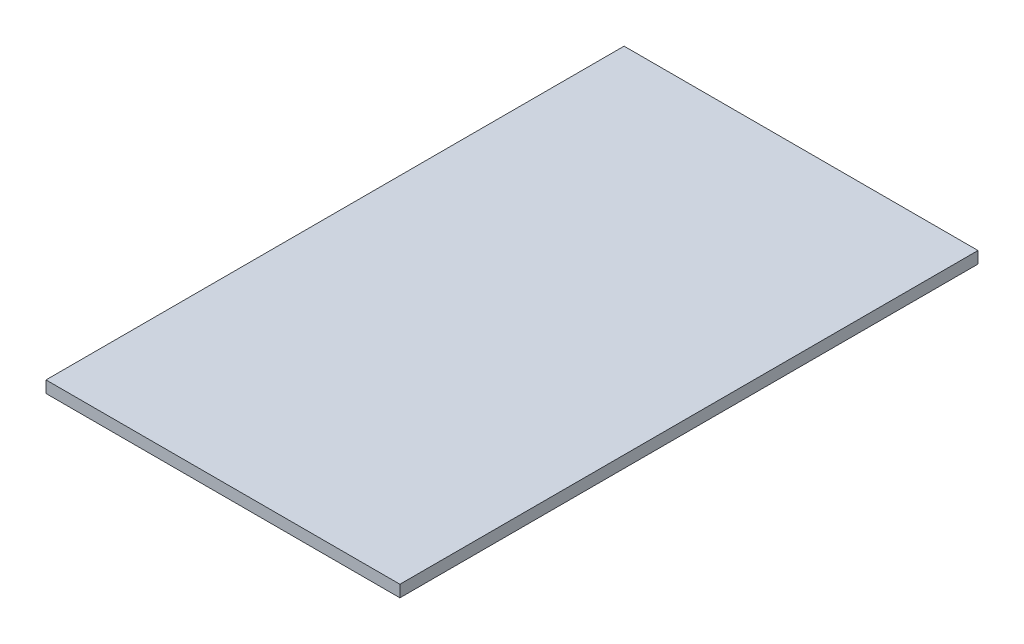
ISO-10303-21;
HEADER;
FILE_DESCRIPTION(('STEP AP214'),'2;1');
FILE_NAME('part.step','',(''),(''),'','','');
FILE_SCHEMA(('AUTOMOTIVE_DESIGN { 1 0 10303 214 1 1 1 1 }'));
ENDSEC;
DATA;
#1=APPLICATION_CONTEXT('core data for automotive mechanical design processes');
#2=APPLICATION_PROTOCOL_DEFINITION('international standard','automotive_design',2000,#1);
#3=PRODUCT_CONTEXT('',#1,'mechanical');
#4=PRODUCT('Part','Part','',(#3));
#5=PRODUCT_RELATED_PRODUCT_CATEGORY('part','',(#4));
#6=PRODUCT_DEFINITION_FORMATION('','',#4);
#7=PRODUCT_DEFINITION_CONTEXT('part definition',#1,'design');
#8=PRODUCT_DEFINITION('design','',#6,#7);
#9=PRODUCT_DEFINITION_SHAPE('','',#8);
#10=(LENGTH_UNIT() NAMED_UNIT(*) SI_UNIT(.MILLI.,.METRE.));
#11=(NAMED_UNIT(*) PLANE_ANGLE_UNIT() SI_UNIT($,.RADIAN.));
#12=(NAMED_UNIT(*) SI_UNIT($,.STERADIAN.) SOLID_ANGLE_UNIT());
#13=UNCERTAINTY_MEASURE_WITH_UNIT(LENGTH_MEASURE(1.E-05),#10,'distance_accuracy_value','');
#14=(GEOMETRIC_REPRESENTATION_CONTEXT(3) GLOBAL_UNCERTAINTY_ASSIGNED_CONTEXT((#13)) GLOBAL_UNIT_ASSIGNED_CONTEXT((#10,
#11,#12)) REPRESENTATION_CONTEXT('',''));
#15=CARTESIAN_POINT('',(0.,0.,0.));
#16=DIRECTION('',(0.,0.,1.));
#17=DIRECTION('',(1.,0.,0.));
#18=AXIS2_PLACEMENT_3D('',#15,#16,#17);
#19=CARTESIAN_POINT('',(0.,12.7,0.));
#20=DIRECTION('',(1.,0.,0.));
#21=DIRECTION('',(0.,0.,-1.));
#22=AXIS2_PLACEMENT_3D('',#19,#20,#21);
#23=PLANE('',#22);
#24=DIRECTION('',(0.,0.,1.));
#25=VECTOR('',#24,1.);
#26=CARTESIAN_POINT('',(0.,0.,0.));
#27=LINE('',#26,#25);
#28=CARTESIAN_POINT('',(0.,0.,-622.3));
#29=VERTEX_POINT('',#28);
#30=CARTESIAN_POINT('',(0.,0.,0.));
#31=VERTEX_POINT('',#30);
#32=EDGE_CURVE('E107',#29,#31,#27,.T.);
#33=ORIENTED_EDGE('',*,*,#32,.T.);
#34=DIRECTION('',(0.,-1.,0.));
#35=VECTOR('',#34,1.);
#36=CARTESIAN_POINT('',(0.,12.7,0.));
#37=LINE('',#36,#35);
#38=CARTESIAN_POINT('',(0.,12.7,0.));
#39=VERTEX_POINT('',#38);
#40=EDGE_CURVE('E11',#39,#31,#37,.T.);
#41=ORIENTED_EDGE('',*,*,#40,.F.);
#42=DIRECTION('',(0.,0.,1.));
#43=VECTOR('',#42,1.);
#44=CARTESIAN_POINT('',(0.,12.7,0.));
#45=LINE('',#44,#43);
#46=CARTESIAN_POINT('',(0.,12.7,-622.3));
#47=VERTEX_POINT('',#46);
#48=EDGE_CURVE('E91',#47,#39,#45,.T.);
#49=ORIENTED_EDGE('',*,*,#48,.F.);
#50=DIRECTION('',(0.,-1.,0.));
#51=VECTOR('',#50,1.);
#52=CARTESIAN_POINT('',(0.,12.7,-622.3));
#53=LINE('',#52,#51);
#54=EDGE_CURVE('E103',#47,#29,#53,.T.);
#55=ORIENTED_EDGE('',*,*,#54,.T.);
#56=EDGE_LOOP('',(#33,#41,#49,#55));
#57=FACE_BOUND('',#56,.T.);
#58=ADVANCED_FACE('F39',(#57),#23,.F.);
#59=CARTESIAN_POINT('',(0.,12.7,0.));
#60=DIRECTION('',(0.,0.,-1.));
#61=DIRECTION('',(-1.,0.,0.));
#62=AXIS2_PLACEMENT_3D('',#59,#60,#61);
#63=PLANE('',#62);
#64=DIRECTION('',(1.,0.,0.));
#65=VECTOR('',#64,1.);
#66=CARTESIAN_POINT('',(0.,0.,0.));
#67=LINE('',#66,#65);
#68=CARTESIAN_POINT('',(381.,0.,0.));
#69=VERTEX_POINT('',#68);
#70=EDGE_CURVE('E96',#31,#69,#67,.T.);
#71=ORIENTED_EDGE('',*,*,#70,.T.);
#72=DIRECTION('',(0.,-1.,0.));
#73=VECTOR('',#72,1.);
#74=CARTESIAN_POINT('',(381.,12.7,0.));
#75=LINE('',#74,#73);
#76=CARTESIAN_POINT('',(381.,12.7,0.));
#77=VERTEX_POINT('',#76);
#78=EDGE_CURVE('E48',#77,#69,#75,.T.);
#79=ORIENTED_EDGE('',*,*,#78,.F.);
#80=DIRECTION('',(1.,0.,0.));
#81=VECTOR('',#80,1.);
#82=CARTESIAN_POINT('',(0.,12.7,0.));
#83=LINE('',#82,#81);
#84=EDGE_CURVE('E86',#39,#77,#83,.T.);
#85=ORIENTED_EDGE('',*,*,#84,.F.);
#86=ORIENTED_EDGE('',*,*,#40,.T.);
#87=EDGE_LOOP('',(#71,#79,#85,#86));
#88=FACE_BOUND('',#87,.T.);
#89=ADVANCED_FACE('F95',(#88),#63,.F.);
#90=CARTESIAN_POINT('',(381.,12.7,0.));
#91=DIRECTION('',(-1.,0.,0.));
#92=DIRECTION('',(0.,0.,1.));
#93=AXIS2_PLACEMENT_3D('',#90,#91,#92);
#94=PLANE('',#93);
#95=DIRECTION('',(0.,0.,-1.));
#96=VECTOR('',#95,1.);
#97=CARTESIAN_POINT('',(381.,0.,0.));
#98=LINE('',#97,#96);
#99=CARTESIAN_POINT('',(381.,0.,-622.3));
#100=VERTEX_POINT('',#99);
#101=EDGE_CURVE('E73',#69,#100,#98,.T.);
#102=ORIENTED_EDGE('',*,*,#101,.T.);
#103=DIRECTION('',(0.,-1.,0.));
#104=VECTOR('',#103,1.);
#105=CARTESIAN_POINT('',(381.,12.7,-622.3));
#106=LINE('',#105,#104);
#107=CARTESIAN_POINT('',(381.,12.7,-622.3));
#108=VERTEX_POINT('',#107);
#109=EDGE_CURVE('E98',#108,#100,#106,.T.);
#110=ORIENTED_EDGE('',*,*,#109,.F.);
#111=DIRECTION('',(0.,0.,-1.));
#112=VECTOR('',#111,1.);
#113=CARTESIAN_POINT('',(381.,12.7,0.));
#114=LINE('',#113,#112);
#115=EDGE_CURVE('E89',#77,#108,#114,.T.);
#116=ORIENTED_EDGE('',*,*,#115,.F.);
#117=ORIENTED_EDGE('',*,*,#78,.T.);
#118=EDGE_LOOP('',(#102,#110,#116,#117));
#119=FACE_BOUND('',#118,.T.);
#120=ADVANCED_FACE('F99',(#119),#94,.F.);
#121=CARTESIAN_POINT('',(0.,12.7,-622.3));
#122=DIRECTION('',(0.,0.,1.));
#123=DIRECTION('',(1.,0.,0.));
#124=AXIS2_PLACEMENT_3D('',#121,#122,#123);
#125=PLANE('',#124);
#126=DIRECTION('',(-1.,0.,0.));
#127=VECTOR('',#126,1.);
#128=CARTESIAN_POINT('',(0.,0.,-622.3));
#129=LINE('',#128,#127);
#130=EDGE_CURVE('E79',#100,#29,#129,.T.);
#131=ORIENTED_EDGE('',*,*,#130,.T.);
#132=ORIENTED_EDGE('',*,*,#54,.F.);
#133=DIRECTION('',(-1.,0.,0.));
#134=VECTOR('',#133,1.);
#135=CARTESIAN_POINT('',(0.,12.7,-622.3));
#136=LINE('',#135,#134);
#137=EDGE_CURVE('E56',#108,#47,#136,.T.);
#138=ORIENTED_EDGE('',*,*,#137,.F.);
#139=ORIENTED_EDGE('',*,*,#109,.T.);
#140=EDGE_LOOP('',(#131,#132,#138,#139));
#141=FACE_BOUND('',#140,.T.);
#142=ADVANCED_FACE('F120',(#141),#125,.F.);
#143=CARTESIAN_POINT('',(0.,12.7,0.));
#144=DIRECTION('',(0.,-1.,0.));
#145=DIRECTION('',(0.,0.,-1.));
#146=AXIS2_PLACEMENT_3D('',#143,#144,#145);
#147=PLANE('',#146);
#148=ORIENTED_EDGE('',*,*,#48,.T.);
#149=ORIENTED_EDGE('',*,*,#84,.T.);
#150=ORIENTED_EDGE('',*,*,#115,.T.);
#151=ORIENTED_EDGE('',*,*,#137,.T.);
#152=EDGE_LOOP('',(#148,#149,#150,#151));
#153=FACE_BOUND('',#152,.T.);
#154=ADVANCED_FACE('F87',(#153),#147,.F.);
#155=CARTESIAN_POINT('',(0.,0.,0.));
#156=DIRECTION('',(0.,-1.,0.));
#157=DIRECTION('',(0.,0.,-1.));
#158=AXIS2_PLACEMENT_3D('',#155,#156,#157);
#159=PLANE('',#158);
#160=ORIENTED_EDGE('',*,*,#32,.F.);
#161=ORIENTED_EDGE('',*,*,#130,.F.);
#162=ORIENTED_EDGE('',*,*,#101,.F.);
#163=ORIENTED_EDGE('',*,*,#70,.F.);
#164=EDGE_LOOP('',(#160,#161,#162,#163));
#165=FACE_BOUND('',#164,.T.);
#166=ADVANCED_FACE('F123',(#165),#159,.T.);
#167=CLOSED_SHELL('',(#58,#89,#120,#142,#154,#166));
#168=MANIFOLD_SOLID_BREP('B2',#167);
#169=ADVANCED_BREP_SHAPE_REPRESENTATION('',(#18,#168),#14);
#170=SHAPE_DEFINITION_REPRESENTATION(#9,#169);
ENDSEC;
END-ISO-10303-21;
